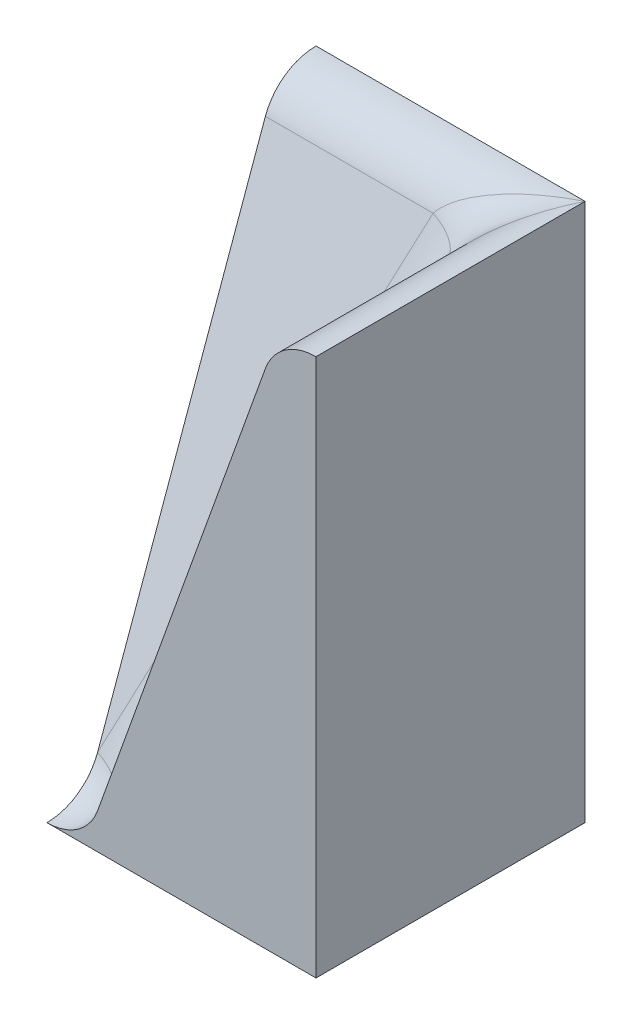
ISO-10303-21;
HEADER;
FILE_DESCRIPTION(('STEP AP214'),'2;1');
FILE_NAME('part.step','',(''),(''),'','','');
FILE_SCHEMA(('AUTOMOTIVE_DESIGN { 1 0 10303 214 1 1 1 1 }'));
ENDSEC;
DATA;
#1=APPLICATION_CONTEXT('core data for automotive mechanical design processes');
#2=APPLICATION_PROTOCOL_DEFINITION('international standard','automotive_design',2000,#1);
#3=PRODUCT_CONTEXT('',#1,'mechanical');
#4=PRODUCT('Part','Part','',(#3));
#5=PRODUCT_RELATED_PRODUCT_CATEGORY('part','',(#4));
#6=PRODUCT_DEFINITION_FORMATION('','',#4);
#7=PRODUCT_DEFINITION_CONTEXT('part definition',#1,'design');
#8=PRODUCT_DEFINITION('design','',#6,#7);
#9=PRODUCT_DEFINITION_SHAPE('','',#8);
#10=(LENGTH_UNIT() NAMED_UNIT(*) SI_UNIT(.MILLI.,.METRE.));
#11=(NAMED_UNIT(*) PLANE_ANGLE_UNIT() SI_UNIT($,.RADIAN.));
#12=(NAMED_UNIT(*) SI_UNIT($,.STERADIAN.) SOLID_ANGLE_UNIT());
#13=UNCERTAINTY_MEASURE_WITH_UNIT(LENGTH_MEASURE(1.E-05),#10,'distance_accuracy_value','');
#14=(GEOMETRIC_REPRESENTATION_CONTEXT(3) GLOBAL_UNCERTAINTY_ASSIGNED_CONTEXT((#13)) GLOBAL_UNIT_ASSIGNED_CONTEXT((#10,
#11,#12)) REPRESENTATION_CONTEXT('',''));
#15=CARTESIAN_POINT('',(0.,0.,0.));
#16=DIRECTION('',(0.,0.,1.));
#17=DIRECTION('',(1.,0.,0.));
#18=AXIS2_PLACEMENT_3D('',#15,#16,#17);
#19=CARTESIAN_POINT('',(188.21652956931,132.364669019181,-1000.));
#20=DIRECTION('',(-0.941082647846552,0.338176654904095,0.));
#21=DIRECTION('',(-0.338176654904095,-0.941082647846552,0.));
#22=AXIS2_PLACEMENT_3D('',#19,#20,#21);
#23=PLANE('',#22);
#24=DIRECTION('',(0.,0.,1.));
#25=VECTOR('',#24,1.);
#26=CARTESIAN_POINT('',(811.78347043069,1867.63533098082,-1000.));
#27=LINE('',#26,#25);
#28=CARTESIAN_POINT('',(811.78347043069,1867.63533098082,-623.56694086138));
#29=VERTEX_POINT('',#28);
#30=CARTESIAN_POINT('',(811.78347043069,1867.63533098082,0.));
#31=VERTEX_POINT('',#30);
#32=EDGE_CURVE('E146',#29,#31,#27,.T.);
#33=ORIENTED_EDGE('',*,*,#32,.F.);
#34=DIRECTION('',(-0.320354031960646,-0.891485607518773,0.320354031960646));
#35=VECTOR('',#34,1.);
#36=CARTESIAN_POINT('',(290.843235362753,417.955677822706,-102.626705793443));
#37=LINE('',#36,#35);
#38=CARTESIAN_POINT('',(188.21652956931,132.364669019181,0.));
#39=VERTEX_POINT('',#38);
#40=EDGE_CURVE('E42',#29,#39,#37,.T.);
#41=ORIENTED_EDGE('',*,*,#40,.T.);
#42=DIRECTION('',(-0.338176654904095,-0.941082647846552,0.));
#43=VECTOR('',#42,1.);
#44=CARTESIAN_POINT('',(188.21652956931,132.364669019181,0.));
#45=LINE('',#44,#43);
#46=EDGE_CURVE('E99',#31,#39,#45,.T.);
#47=ORIENTED_EDGE('',*,*,#46,.F.);
#48=EDGE_LOOP('',(#33,#41,#47));
#49=FACE_BOUND('',#48,.T.);
#50=ADVANCED_FACE('F33',(#49),#23,.T.);
#51=CARTESIAN_POINT('',(1000.,1800.,-1000.));
#52=DIRECTION('',(0.,0.,1.));
#53=DIRECTION('',(1.,0.,0.));
#54=AXIS2_PLACEMENT_3D('',#51,#52,#53);
#55=CYLINDRICAL_SURFACE('',#54,200.);
#56=DIRECTION('',(0.,0.,1.));
#57=VECTOR('',#56,1.);
#58=CARTESIAN_POINT('',(1000.,2000.,-1000.));
#59=LINE('',#58,#57);
#60=CARTESIAN_POINT('',(1000.,2000.,-1000.));
#61=VERTEX_POINT('',#60);
#62=CARTESIAN_POINT('',(1000.,2000.,0.));
#63=VERTEX_POINT('',#62);
#64=EDGE_CURVE('E149',#61,#63,#59,.T.);
#65=ORIENTED_EDGE('',*,*,#64,.F.);
#66=CARTESIAN_POINT('',(1000.,1800.,-1000.));
#67=DIRECTION('',(-0.894427190999916,0.,-0.447213595499958));
#68=DIRECTION('',(-0.447213595499958,0.,0.894427190999916));
#69=AXIS2_PLACEMENT_3D('',#66,#67,#68);
#70=ELLIPSE('',#69,447.213595499958,200.);
#71=EDGE_CURVE('E148',#61,#29,#70,.F.);
#72=ORIENTED_EDGE('',*,*,#71,.T.);
#73=ORIENTED_EDGE('',*,*,#32,.T.);
#74=CARTESIAN_POINT('',(1000.,1800.,0.));
#75=DIRECTION('',(0.,0.,1.));
#76=DIRECTION('',(1.,0.,0.));
#77=AXIS2_PLACEMENT_3D('',#74,#75,#76);
#78=CIRCLE('',#77,200.);
#79=EDGE_CURVE('E143',#63,#31,#78,.T.);
#80=ORIENTED_EDGE('',*,*,#79,.F.);
#81=EDGE_LOOP('',(#65,#72,#73,#80));
#82=FACE_BOUND('',#81,.T.);
#83=ADVANCED_FACE('F168',(#82),#55,.T.);
#84=CARTESIAN_POINT('',(1000.,0.,-1000.));
#85=DIRECTION('',(1.,0.,0.));
#86=DIRECTION('',(0.,0.,-1.));
#87=AXIS2_PLACEMENT_3D('',#84,#85,#86);
#88=PLANE('',#87);
#89=DIRECTION('',(0.,1.,0.));
#90=VECTOR('',#89,1.);
#91=CARTESIAN_POINT('',(1000.,0.,-1000.));
#92=LINE('',#91,#90);
#93=CARTESIAN_POINT('',(1000.,0.,-1000.));
#94=VERTEX_POINT('',#93);
#95=EDGE_CURVE('E124',#94,#61,#92,.T.);
#96=ORIENTED_EDGE('',*,*,#95,.T.);
#97=ORIENTED_EDGE('',*,*,#64,.T.);
#98=DIRECTION('',(0.,1.,0.));
#99=VECTOR('',#98,1.);
#100=CARTESIAN_POINT('',(1000.,0.,0.));
#101=LINE('',#100,#99);
#102=CARTESIAN_POINT('',(1000.,0.,0.));
#103=VERTEX_POINT('',#102);
#104=EDGE_CURVE('E114',#103,#63,#101,.T.);
#105=ORIENTED_EDGE('',*,*,#104,.F.);
#106=DIRECTION('',(0.,0.,1.));
#107=VECTOR('',#106,1.);
#108=CARTESIAN_POINT('',(1000.,0.,-1000.));
#109=LINE('',#108,#107);
#110=EDGE_CURVE('E112',#94,#103,#109,.T.);
#111=ORIENTED_EDGE('',*,*,#110,.F.);
#112=EDGE_LOOP('',(#96,#97,#105,#111));
#113=FACE_BOUND('',#112,.T.);
#114=ADVANCED_FACE('F189',(#113),#88,.T.);
#115=CARTESIAN_POINT('',(0.,0.,-1000.));
#116=DIRECTION('',(0.,-1.,0.));
#117=DIRECTION('',(0.,0.,-1.));
#118=AXIS2_PLACEMENT_3D('',#115,#116,#117);
#119=PLANE('',#118);
#120=DIRECTION('',(1.,0.,0.));
#121=VECTOR('',#120,1.);
#122=CARTESIAN_POINT('',(0.,0.,0.));
#123=LINE('',#122,#121);
#124=CARTESIAN_POINT('',(0.,0.,0.));
#125=VERTEX_POINT('',#124);
#126=EDGE_CURVE('E96',#125,#103,#123,.T.);
#127=ORIENTED_EDGE('',*,*,#126,.F.);
#128=DIRECTION('',(0.,0.,1.));
#129=VECTOR('',#128,1.);
#130=CARTESIAN_POINT('',(0.,0.,-1000.));
#131=LINE('',#130,#129);
#132=CARTESIAN_POINT('',(0.,0.,-1000.));
#133=VERTEX_POINT('',#132);
#134=EDGE_CURVE('E110',#133,#125,#131,.T.);
#135=ORIENTED_EDGE('',*,*,#134,.F.);
#136=DIRECTION('',(1.,0.,0.));
#137=VECTOR('',#136,1.);
#138=CARTESIAN_POINT('',(0.,0.,-1000.));
#139=LINE('',#138,#137);
#140=EDGE_CURVE('E138',#133,#94,#139,.T.);
#141=ORIENTED_EDGE('',*,*,#140,.T.);
#142=ORIENTED_EDGE('',*,*,#110,.T.);
#143=EDGE_LOOP('',(#127,#135,#141,#142));
#144=FACE_BOUND('',#143,.T.);
#145=ADVANCED_FACE('F108',(#144),#119,.T.);
#146=CARTESIAN_POINT('',(0.,200.,-1000.));
#147=DIRECTION('',(0.,0.,1.));
#148=DIRECTION('',(1.,0.,0.));
#149=AXIS2_PLACEMENT_3D('',#146,#147,#148);
#150=PLANE('',#149);
#151=ORIENTED_EDGE('',*,*,#140,.F.);
#152=DIRECTION('',(0.,1.,0.));
#153=VECTOR('',#152,1.);
#154=CARTESIAN_POINT('',(0.,0.,-1000.));
#155=LINE('',#154,#153);
#156=CARTESIAN_POINT('',(0.,2000.,-1000.));
#157=VERTEX_POINT('',#156);
#158=EDGE_CURVE('E123',#133,#157,#155,.T.);
#159=ORIENTED_EDGE('',*,*,#158,.T.);
#160=DIRECTION('',(-1.,0.,0.));
#161=VECTOR('',#160,1.);
#162=CARTESIAN_POINT('',(1000.,2000.,-1000.));
#163=LINE('',#162,#161);
#164=EDGE_CURVE('E104',#61,#157,#163,.T.);
#165=ORIENTED_EDGE('',*,*,#164,.F.);
#166=ORIENTED_EDGE('',*,*,#95,.F.);
#167=EDGE_LOOP('',(#151,#159,#165,#166));
#168=FACE_BOUND('',#167,.T.);
#169=ADVANCED_FACE('F179',(#168),#150,.F.);
#170=CARTESIAN_POINT('',(0.,200.,0.));
#171=DIRECTION('',(0.,0.,1.));
#172=DIRECTION('',(1.,0.,0.));
#173=AXIS2_PLACEMENT_3D('',#170,#171,#172);
#174=PLANE('',#173);
#175=CARTESIAN_POINT('',(0.,200.,0.));
#176=DIRECTION('',(0.,0.,-1.));
#177=DIRECTION('',(1.,0.,0.));
#178=AXIS2_PLACEMENT_3D('',#175,#176,#177);
#179=CIRCLE('',#178,200.);
#180=EDGE_CURVE('E92',#39,#125,#179,.T.);
#181=ORIENTED_EDGE('',*,*,#180,.T.);
#182=ORIENTED_EDGE('',*,*,#126,.T.);
#183=ORIENTED_EDGE('',*,*,#104,.T.);
#184=ORIENTED_EDGE('',*,*,#79,.T.);
#185=ORIENTED_EDGE('',*,*,#46,.T.);
#186=EDGE_LOOP('',(#181,#182,#183,#184,#185));
#187=FACE_BOUND('',#186,.T.);
#188=ADVANCED_FACE('F94',(#187),#174,.T.);
#189=CARTESIAN_POINT('',(1000.,1800.,-1000.));
#190=DIRECTION('',(-1.,0.,0.));
#191=DIRECTION('',(0.,0.,1.));
#192=AXIS2_PLACEMENT_3D('',#189,#190,#191);
#193=CYLINDRICAL_SURFACE('',#192,200.);
#194=DIRECTION('',(-1.,0.,0.));
#195=VECTOR('',#194,1.);
#196=CARTESIAN_POINT('',(1000.,1867.63533098082,-811.78347043069));
#197=LINE('',#196,#195);
#198=CARTESIAN_POINT('',(623.566940861379,1867.63533098082,-811.78347043069));
#199=VERTEX_POINT('',#198);
#200=CARTESIAN_POINT('',(0.,1867.63533098082,-811.78347043069));
#201=VERTEX_POINT('',#200);
#202=EDGE_CURVE('E134',#199,#201,#197,.T.);
#203=ORIENTED_EDGE('',*,*,#202,.F.);
#204=CARTESIAN_POINT('',(1000.,1800.,-1000.));
#205=DIRECTION('',(-0.447213595499958,0.,-0.894427190999916));
#206=DIRECTION('',(-0.894427190999916,0.,0.447213595499958));
#207=AXIS2_PLACEMENT_3D('',#204,#205,#206);
#208=ELLIPSE('',#207,447.213595499958,200.);
#209=EDGE_CURVE('E154',#199,#61,#208,.T.);
#210=ORIENTED_EDGE('',*,*,#209,.T.);
#211=ORIENTED_EDGE('',*,*,#164,.T.);
#212=CARTESIAN_POINT('',(0.,1800.,-1000.));
#213=DIRECTION('',(1.,0.,0.));
#214=DIRECTION('',(0.,0.,-1.));
#215=AXIS2_PLACEMENT_3D('',#212,#213,#214);
#216=CIRCLE('',#215,200.);
#217=EDGE_CURVE('E127',#157,#201,#216,.T.);
#218=ORIENTED_EDGE('',*,*,#217,.T.);
#219=EDGE_LOOP('',(#203,#210,#211,#218));
#220=FACE_BOUND('',#219,.T.);
#221=ADVANCED_FACE('F171',(#220),#193,.T.);
#222=CARTESIAN_POINT('',(1000.,132.364669019181,-188.21652956931));
#223=DIRECTION('',(0.,-0.338176654904095,-0.941082647846552));
#224=DIRECTION('',(0.,0.941082647846552,-0.338176654904095));
#225=AXIS2_PLACEMENT_3D('',#222,#223,#224);
#226=PLANE('',#225);
#227=DIRECTION('',(0.,-0.941082647846552,0.338176654904095));
#228=VECTOR('',#227,1.);
#229=CARTESIAN_POINT('',(0.,132.364669019181,-188.21652956931));
#230=LINE('',#229,#228);
#231=CARTESIAN_POINT('',(0.,132.364669019181,-188.21652956931));
#232=VERTEX_POINT('',#231);
#233=EDGE_CURVE('E132',#201,#232,#230,.T.);
#234=ORIENTED_EDGE('',*,*,#233,.T.);
#235=DIRECTION('',(-0.320354031960646,-0.891485607518773,0.320354031960646));
#236=VECTOR('',#235,1.);
#237=CARTESIAN_POINT('',(102.626705793442,417.955677822705,-290.843235362753));
#238=LINE('',#237,#236);
#239=EDGE_CURVE('E11',#232,#199,#238,.F.);
#240=ORIENTED_EDGE('',*,*,#239,.T.);
#241=ORIENTED_EDGE('',*,*,#202,.T.);
#242=EDGE_LOOP('',(#234,#240,#241));
#243=FACE_BOUND('',#242,.T.);
#244=ADVANCED_FACE('F176',(#243),#226,.F.);
#245=CARTESIAN_POINT('',(0.,200.,0.));
#246=DIRECTION('',(1.,0.,0.));
#247=DIRECTION('',(0.,0.,-1.));
#248=AXIS2_PLACEMENT_3D('',#245,#246,#247);
#249=PLANE('',#248);
#250=CARTESIAN_POINT('',(0.,200.,0.));
#251=DIRECTION('',(-1.,0.,0.));
#252=DIRECTION('',(0.,0.,-1.));
#253=AXIS2_PLACEMENT_3D('',#250,#251,#252);
#254=CIRCLE('',#253,200.);
#255=EDGE_CURVE('E121',#232,#125,#254,.T.);
#256=ORIENTED_EDGE('',*,*,#255,.F.);
#257=ORIENTED_EDGE('',*,*,#233,.F.);
#258=ORIENTED_EDGE('',*,*,#217,.F.);
#259=ORIENTED_EDGE('',*,*,#158,.F.);
#260=ORIENTED_EDGE('',*,*,#134,.T.);
#261=EDGE_LOOP('',(#256,#257,#258,#259,#260));
#262=FACE_BOUND('',#261,.T.);
#263=ADVANCED_FACE('F119',(#262),#249,.F.);
#264=CARTESIAN_POINT('',(0.,200.,0.));
#265=DIRECTION('',(0.,0.,1.));
#266=DIRECTION('',(1.,0.,0.));
#267=AXIS2_PLACEMENT_3D('',#264,#265,#266);
#268=SPHERICAL_SURFACE('',#267,200.);
#269=ORIENTED_EDGE('',*,*,#255,.T.);
#270=ORIENTED_EDGE('',*,*,#180,.F.);
#271=CARTESIAN_POINT('',(0.,200.,0.));
#272=DIRECTION('',(-0.320354031960646,-0.891485607518773,0.320354031960646));
#273=DIRECTION('',(0.,-0.338176654904095,-0.941082647846551));
#274=AXIS2_PLACEMENT_3D('',#271,#272,#273);
#275=CIRCLE('',#274,200.);
#276=EDGE_CURVE('E37',#232,#39,#275,.T.);
#277=ORIENTED_EDGE('',*,*,#276,.F.);
#278=EDGE_LOOP('',(#269,#270,#277));
#279=FACE_BOUND('',#278,.T.);
#280=ADVANCED_FACE('F35',(#279),#268,.F.);
#281=CARTESIAN_POINT('',(102.626705793442,485.591008803525,-102.626705793442));
#282=DIRECTION('',(-0.320354031960646,-0.891485607518773,0.320354031960646));
#283=DIRECTION('',(0.,-0.338176654904095,-0.941082647846552));
#284=AXIS2_PLACEMENT_3D('',#281,#282,#283);
#285=CYLINDRICAL_SURFACE('',#284,200.);
#286=ORIENTED_EDGE('',*,*,#276,.T.);
#287=ORIENTED_EDGE('',*,*,#40,.F.);
#288=CARTESIAN_POINT('',(623.566940861379,1935.27066196164,-623.56694086138));
#289=DIRECTION('',(-0.320354031960645,-0.891485607518773,0.320354031960646));
#290=DIRECTION('',(0.,-0.338176654904095,-0.941082647846551));
#291=AXIS2_PLACEMENT_3D('',#288,#289,#290);
#292=CIRCLE('',#291,200.);
#293=EDGE_CURVE('E56',#199,#29,#292,.T.);
#294=ORIENTED_EDGE('',*,*,#293,.F.);
#295=ORIENTED_EDGE('',*,*,#239,.F.);
#296=EDGE_LOOP('',(#286,#287,#294,#295));
#297=FACE_BOUND('',#296,.T.);
#298=ADVANCED_FACE('F166',(#297),#285,.F.);
#299=CARTESIAN_POINT('',(1000.,2000.,-1000.));
#300=CARTESIAN_POINT('',(1000.,2000.,-1000.));
#301=CARTESIAN_POINT('',(1000.,2000.,-1000.));
#302=CARTESIAN_POINT('',(997.821543042189,1999.99998598145,-995.643086084386));
#303=CARTESIAN_POINT('',(996.732312609734,2000.00009257002,-996.73231260974));
#304=CARTESIAN_POINT('',(995.643086084377,1999.99998598145,-997.821543042193));
#305=CARTESIAN_POINT('',(995.643089758799,1999.96440685523,-991.286179517609));
#306=CARTESIAN_POINT('',(993.464052759437,1999.92881060137,-993.464052759444));
#307=CARTESIAN_POINT('',(991.286179517599,1999.96440685523,-995.643089758804));
#308=CARTESIAN_POINT('',(991.287334725908,1999.82201887214,-982.574669451824));
#309=CARTESIAN_POINT('',(986.933911702079,1999.64404721373,-986.933911702085));
#310=CARTESIAN_POINT('',(982.574669451816,1999.82201887214,-991.287334725912));
#311=CARTESIAN_POINT('',(989.110032983394,1999.71520958786,-978.220065966792));
#312=CARTESIAN_POINT('',(983.670870222132,1999.43046359838,-983.670870222135));
#313=CARTESIAN_POINT('',(978.220065966788,1999.71520958786,-989.110032983397));
#314=CARTESIAN_POINT('',(984.757572444315,1999.43025005547,-969.515144888631));
#315=CARTESIAN_POINT('',(977.156161204686,1998.86116765898,-977.156161204687));
#316=CARTESIAN_POINT('',(969.515144888629,1999.43025005547,-984.757572444316));
#317=CARTESIAN_POINT('',(982.582413838686,1999.25209394171,-965.164827677375));
#318=CARTESIAN_POINT('',(973.903342500863,1998.50524091031,-973.903342500866));
#319=CARTESIAN_POINT('',(965.164827677372,1999.25209394171,-982.582413838688));
#320=CARTESIAN_POINT('',(978.235665707899,1998.82425188856,-956.4713314158));
#321=CARTESIAN_POINT('',(967.414748888115,1997.65164210636,-967.414748888117));
#322=CARTESIAN_POINT('',(956.471331415798,1998.82425188856,-978.2356657079));
#323=CARTESIAN_POINT('',(976.064076176094,1998.57456608253,-952.128152352188));
#324=CARTESIAN_POINT('',(964.177836107292,1997.15366644307,-964.177836107292));
#325=CARTESIAN_POINT('',(952.128152352188,1998.57456608253,-976.064076176094));
#326=CARTESIAN_POINT('',(969.593388795519,1997.72268953554,-939.186777591037));
#327=CARTESIAN_POINT('',(954.5489193499,1995.45600402381,-954.548919349898));
#328=CARTESIAN_POINT('',(939.186777591038,1997.72268953554,-969.593388795518));
#329=CARTESIAN_POINT('',(965.300960072709,1997.01523097853,-930.601920145415));
#330=CARTESIAN_POINT('',(948.189529441129,1994.04758384981,-948.18952944113));
#331=CARTESIAN_POINT('',(930.601920145415,1997.01523097853,-965.300960072709));
#332=CARTESIAN_POINT('',(956.744640928155,1995.31512940242,-913.489281856307));
#333=CARTESIAN_POINT('',(935.606653135611,1990.68093629114,-935.606653135612));
#334=CARTESIAN_POINT('',(913.489281856306,1995.31512940242,-956.744640928156));
#335=CARTESIAN_POINT('',(952.480749871334,1994.3224927514,-904.961499742667));
#336=CARTESIAN_POINT('',(929.374903381872,1988.71800877709,-929.374903381872));
#337=CARTESIAN_POINT('',(904.961499742667,1994.3224927514,-952.480749871334));
#338=CARTESIAN_POINT('',(944.062689022877,1992.06687743551,-888.125378045754));
#339=CARTESIAN_POINT('',(917.195997314522,1984.2878218244,-917.195997314521));
#340=CARTESIAN_POINT('',(888.125378045754,1992.06687743551,-944.062689022876));
#341=CARTESIAN_POINT('',(939.907877380719,1990.8087026761,-879.815754761438));
#342=CARTESIAN_POINT('',(911.23798283431,1981.82337513585,-911.23798283431));
#343=CARTESIAN_POINT('',(879.815754761438,1990.8087026761,-939.907877380719));
#344=CARTESIAN_POINT('',(931.646451744684,1988.00749237577,-863.292903489369));
#345=CARTESIAN_POINT('',(899.543763921972,1976.38142270471,-899.543763921972));
#346=CARTESIAN_POINT('',(863.292903489369,1988.00749237577,-931.646451744684));
#347=CARTESIAN_POINT('',(927.539837542643,1986.46445806564,-855.079675085288));
#348=CARTESIAN_POINT('',(893.80121785618,1973.39662729483,-893.80121785618));
#349=CARTESIAN_POINT('',(855.079675085288,1986.46445806564,-927.539837542643));
#350=CARTESIAN_POINT('',(919.487054873633,1983.12888621249,-838.974109747265));
#351=CARTESIAN_POINT('',(882.727635063959,1967.01039933759,-882.727635063959));
#352=CARTESIAN_POINT('',(838.974109747264,1983.12888621249,-919.487054873633));
#353=CARTESIAN_POINT('',(915.539424425514,1981.34341886433,-831.078848851021));
#354=CARTESIAN_POINT('',(877.383950313126,1963.61234783072,-877.383950313127));
#355=CARTESIAN_POINT('',(831.078848851021,1981.34341886433,-915.539424425514));
#356=CARTESIAN_POINT('',(907.713875274253,1977.488859412,-815.427750548502));
#357=CARTESIAN_POINT('',(867.006912782094,1956.36515793028,-867.006912782094));
#358=CARTESIAN_POINT('',(815.427750548501,1977.488859412,-907.713875274253));
#359=CARTESIAN_POINT('',(903.835955708618,1975.41977081966,-807.671911417236));
#360=CARTESIAN_POINT('',(861.97005660579,1952.50711971716,-861.97005660579));
#361=CARTESIAN_POINT('',(807.671911417236,1975.41977081966,-903.835955708618));
#362=CARTESIAN_POINT('',(896.285919888373,1971.0607556029,-792.571839776744));
#363=CARTESIAN_POINT('',(852.418347200414,1944.50193880563,-852.418347200413));
#364=CARTESIAN_POINT('',(792.571839776744,1971.0607556029,-896.285919888373));
#365=CARTESIAN_POINT('',(892.611179451483,1968.77993407095,-785.222358902956));
#366=CARTESIAN_POINT('',(847.888677273831,1940.35767559629,-847.888677273831));
#367=CARTESIAN_POINT('',(785.222358902956,1968.77993407095,-892.611179451483));
#368=CARTESIAN_POINT('',(885.355114667715,1963.93771417279,-770.710229335422));
#369=CARTESIAN_POINT('',(839.227149965009,1931.71535809323,-839.227149965009));
#370=CARTESIAN_POINT('',(770.710229335422,1963.93771417279,-885.355114667715));
#371=CARTESIAN_POINT('',(881.773788738447,1961.37632056314,-763.547577476896));
#372=CARTESIAN_POINT('',(835.09536540267,1927.20834343302,-835.09536540267));
#373=CARTESIAN_POINT('',(763.547577476896,1961.37632056314,-881.773788738447));
#374=CARTESIAN_POINT('',(874.855326270105,1956.06759691192,-749.710652540208));
#375=CARTESIAN_POINT('',(827.437444239726,1918.07484094446,-827.437444239726));
#376=CARTESIAN_POINT('',(749.710652540208,1956.06759691192,-874.855326270105));
#377=CARTESIAN_POINT('',(871.51407958048,1953.33099828883,-743.028159160946));
#378=CARTESIAN_POINT('',(823.894393978917,1913.44929725811,-823.894393978917));
#379=CARTESIAN_POINT('',(743.028159160945,1953.33099828883,-871.51407958048));
#380=CARTESIAN_POINT('',(864.951402576022,1947.58353759311,-729.90280515203));
#381=CARTESIAN_POINT('',(817.283079845907,1903.98870072749,-817.283079845907));
#382=CARTESIAN_POINT('',(729.902805152029,1947.58353759311,-864.951402576022));
#383=CARTESIAN_POINT('',(861.729969439306,1944.57268198562,-723.459938878611));
#384=CARTESIAN_POINT('',(814.218714814164,1899.14680212536,-814.218714814164));
#385=CARTESIAN_POINT('',(723.459938878611,1944.57268198562,-861.729969439306));
#386=CARTESIAN_POINT('',(855.561236825335,1938.40394923131,-711.12247365067));
#387=CARTESIAN_POINT('',(808.736842071907,1889.5535593505,-808.736842071907));
#388=CARTESIAN_POINT('',(711.12247365067,1938.40394923131,-855.561236825335));
#389=CARTESIAN_POINT('',(852.608105382456,1935.25775724655,-705.2162107649));
#390=CARTESIAN_POINT('',(806.301136029742,1884.79960639833,-806.301136029742));
#391=CARTESIAN_POINT('',(705.2162107649,1935.25775724655,-852.608105382456));
#392=CARTESIAN_POINT('',(846.850951612381,1928.70273520971,-693.701903224748));
#393=CARTESIAN_POINT('',(801.951889746768,1875.28084053063,-801.951889746768));
#394=CARTESIAN_POINT('',(693.701903224748,1928.70273520971,-846.850951612381));
#395=CARTESIAN_POINT('',(844.046924528382,1925.29391354468,-688.09384905676));
#396=CARTESIAN_POINT('',(800.045370104668,1870.51378050016,-800.045370104668));
#397=CARTESIAN_POINT('',(688.09384905676,1925.29391354468,-844.046924528382));
#398=CARTESIAN_POINT('',(838.733521863404,1918.36936776094,-677.46704372681));
#399=CARTESIAN_POINT('',(796.856754320209,1861.30763926878,-796.856754320209));
#400=CARTESIAN_POINT('',(677.46704372681,1918.36936776094,-838.733521863404));
#401=CARTESIAN_POINT('',(836.216573141186,1914.86527972753,-672.43314628237));
#402=CARTESIAN_POINT('',(795.556998342448,1856.861174928,-795.556998342448));
#403=CARTESIAN_POINT('',(672.43314628237,1914.86527972753,-836.216573141186));
#404=CARTESIAN_POINT('',(831.363406308753,1907.61377532758,-662.726812617503));
#405=CARTESIAN_POINT('',(793.467455019395,1848.20045050985,-793.467455019395));
#406=CARTESIAN_POINT('',(662.726812617503,1907.61377532758,-831.363406308753));
#407=CARTESIAN_POINT('',(829.027180678752,1903.8663690973,-658.054361357503));
#408=CARTESIAN_POINT('',(792.685740246229,1843.99029937015,-792.685740246229));
#409=CARTESIAN_POINT('',(658.054361357503,1903.8663690973,-829.027180678752));
#410=CARTESIAN_POINT('',(825.727664492867,1898.15147064792,-651.455328985735));
#411=CARTESIAN_POINT('',(791.896712195577,1838.07033287864,-791.896712195577));
#412=CARTESIAN_POINT('',(651.455328985735,1898.15147064792,-825.727664492867));
#413=CARTESIAN_POINT('',(824.684174307805,1896.27574827208,-649.368348615612));
#414=CARTESIAN_POINT('',(791.69798199305,1836.19224696985,-791.69798199305));
#415=CARTESIAN_POINT('',(649.368348615612,1896.27574827208,-824.684174307805));
#416=CARTESIAN_POINT('',(822.647599135652,1892.47043573619,-645.295198271302));
#417=CARTESIAN_POINT('',(791.408622967789,1832.53914968761,-791.408622967789));
#418=CARTESIAN_POINT('',(645.295198271302,1892.47043573619,-822.647599135652));
#419=CARTESIAN_POINT('',(821.654509568578,1890.54085049552,-643.30901913715));
#420=CARTESIAN_POINT('',(791.318806131024,1830.76517327699,-791.318806131024));
#421=CARTESIAN_POINT('',(643.30901913715,1890.54085049552,-821.654509568578));
#422=CARTESIAN_POINT('',(819.721781524135,1886.62865988829,-639.443563048264));
#423=CARTESIAN_POINT('',(791.240601964452,1827.33629224428,-791.240601964452));
#424=CARTESIAN_POINT('',(639.443563048264,1886.62865988829,-819.721781524135));
#425=CARTESIAN_POINT('',(818.782146700051,1884.64605091148,-637.5642934001));
#426=CARTESIAN_POINT('',(791.252969758162,1825.68262047924,-791.252969758162));
#427=CARTESIAN_POINT('',(637.564293400099,1884.64605091148,-818.782146700051));
#428=CARTESIAN_POINT('',(816.959703942842,1880.6294785145,-633.919407885684));
#429=CARTESIAN_POINT('',(791.370097390906,1822.50988154364,-791.370097390906));
#430=CARTESIAN_POINT('',(633.919407885684,1880.6294785145,-816.959703942842));
#431=CARTESIAN_POINT('',(816.076890423089,1878.59552017042,-632.153780846175));
#432=CARTESIAN_POINT('',(791.475492288582,1820.99217384578,-791.475492288582));
#433=CARTESIAN_POINT('',(632.153780846175,1878.59552017042,-816.076890423089));
#434=CARTESIAN_POINT('',(814.404633200779,1874.55833450794,-628.809266401561));
#435=CARTESIAN_POINT('',(791.761561563591,1818.16177556907,-791.761561563591));
#436=CARTESIAN_POINT('',(628.809266401561,1874.55833450794,-814.404633200779));
#437=CARTESIAN_POINT('',(813.612888613188,1872.55701397908,-627.225777226387));
#438=CARTESIAN_POINT('',(791.939634460055,1816.84437091328,-791.939634460055));
#439=CARTESIAN_POINT('',(627.225777226387,1872.55701397908,-813.612888613188));
#440=CARTESIAN_POINT('',(812.087841281517,1868.51054571743,-624.17568256302));
#441=CARTESIAN_POINT('',(792.358454091455,1814.35675770487,-792.358454091456));
#442=CARTESIAN_POINT('',(624.17568256302,1868.51054571743,-812.087841281517));
#443=CARTESIAN_POINT('',(811.354532417229,1866.46540260289,-622.709064834409));
#444=CARTESIAN_POINT('',(792.599521445729,1813.18790685861,-792.59952144573));
#445=CARTESIAN_POINT('',(622.709064834409,1866.46540260289,-811.354532417229));
#446=CARTESIAN_POINT('',(809.949174597373,1862.33334614537,-619.898349194697));
#447=CARTESIAN_POINT('',(793.130335092017,1811.00471243973,-793.130335092017));
#448=CARTESIAN_POINT('',(619.898349194697,1862.33334614537,-809.949174597373));
#449=CARTESIAN_POINT('',(809.277127150348,1860.24643177532,-618.554254300683));
#450=CARTESIAN_POINT('',(793.420269822428,1809.99175352607,-793.420269822428));
#451=CARTESIAN_POINT('',(618.554254300683,1860.24643177532,-809.277127150348));
#452=CARTESIAN_POINT('',(807.997180193307,1856.03359308159,-615.994360386626));
#453=CARTESIAN_POINT('',(794.033154462321,1808.12443509919,-794.033154462321));
#454=CARTESIAN_POINT('',(615.994360386626,1856.03359308159,-807.997180193307));
#455=CARTESIAN_POINT('',(807.389280308593,1853.90766898587,-614.778560617184));
#456=CARTESIAN_POINT('',(794.356149455917,1807.27140826923,-794.356149455917));
#457=CARTESIAN_POINT('',(614.778560617184,1853.90766898587,-807.389280308593));
#458=CARTESIAN_POINT('',(806.257539356103,1849.68395439724,-612.515078712207));
#459=CARTESIAN_POINT('',(795.008313290213,1805.74707166212,-795.008313290213));
#460=CARTESIAN_POINT('',(612.515078712207,1849.68395439724,-806.257539356103));
#461=CARTESIAN_POINT('',(805.731730537322,1847.58721887503,-611.46346107466));
#462=CARTESIAN_POINT('',(795.336977119013,1805.07212476592,-795.336977119013));
#463=CARTESIAN_POINT('',(611.46346107466,1847.58721887503,-805.731730537322));
#464=CARTESIAN_POINT('',(804.745459123923,1843.36320842358,-609.490918247829));
#465=CARTESIAN_POINT('',(795.993395580669,1803.86707783646,-795.993395580669));
#466=CARTESIAN_POINT('',(609.490918247829,1843.36320842358,-804.745459123923));
#467=CARTESIAN_POINT('',(804.284996193401,1841.23593365138,-608.569992386733));
#468=CARTESIAN_POINT('',(796.320968312562,1803.33796766918,-796.320968312562));
#469=CARTESIAN_POINT('',(608.569992386733,1841.23593365138,-804.284996193401));
#470=CARTESIAN_POINT('',(803.431613518117,1836.95448586265,-606.863227036166));
#471=CARTESIAN_POINT('',(796.959113342349,1802.4157002832,-796.959113342349));
#472=CARTESIAN_POINT('',(606.863227036165,1836.95448586265,-803.431613518117));
#473=CARTESIAN_POINT('',(803.038692222842,1834.80031346481,-606.077384445666));
#474=CARTESIAN_POINT('',(797.269429152224,1802.02336186169,-797.269429152224));
#475=CARTESIAN_POINT('',(606.077384445666,1834.80031346481,-803.038692222842));
#476=CARTESIAN_POINT('',(802.322331712118,1830.46896392002,-604.644663424254));
#477=CARTESIAN_POINT('',(797.857661106272,1801.36101038263,-797.857661106272));
#478=CARTESIAN_POINT('',(604.644663424254,1830.46896392002,-802.322331712118));
#479=CARTESIAN_POINT('',(801.998892305812,1828.29178683628,-603.997784611628));
#480=CARTESIAN_POINT('',(798.135279128516,1801.09162923248,-798.135279128516));
#481=CARTESIAN_POINT('',(603.997784611628,1828.29178683628,-801.998892305812));
#482=CARTESIAN_POINT('',(801.427855697733,1823.95433352809,-602.855711395462));
#483=CARTESIAN_POINT('',(798.63998164395,1800.66054051724,-798.63998164395));
#484=CARTESIAN_POINT('',(602.855711395462,1823.95433352809,-801.427855697733));
#485=CARTESIAN_POINT('',(801.179108120889,1821.79436034152,-602.35821624178));
#486=CARTESIAN_POINT('',(798.867538134501,1800.4975611356,-798.867538134501));
#487=CARTESIAN_POINT('',(602.35821624178,1821.79436034152,-801.179108120889));
#488=CARTESIAN_POINT('',(800.751739494819,1817.46057463552,-601.503478989636));
#489=CARTESIAN_POINT('',(799.26652140357,1800.2510901987,-799.26652140357));
#490=CARTESIAN_POINT('',(601.503478989636,1817.46057463552,-800.751739494819));
#491=CARTESIAN_POINT('',(800.573118161656,1815.28676217217,-601.146236323297));
#492=CARTESIAN_POINT('',(799.437694426338,1800.1678497901,-799.437694426338));
#493=CARTESIAN_POINT('',(601.146236323297,1815.28676217217,-800.573118161656));
#494=CARTESIAN_POINT('',(800.286942504092,1810.9298132764,-600.57388500817));
#495=CARTESIAN_POINT('',(799.715319836448,1800.05634358954,-799.715319836448));
#496=CARTESIAN_POINT('',(600.57388500817,1810.9298132764,-800.286942504092));
#497=CARTESIAN_POINT('',(800.179387500228,1808.74667693334,-600.358775000452));
#498=CARTESIAN_POINT('',(799.821583381844,1800.02819461887,-799.821583381844));
#499=CARTESIAN_POINT('',(600.358775000452,1808.74667693334,-800.179387500228));
#500=CARTESIAN_POINT('',(800.035916209173,1804.37569373027,-600.07183241835));
#501=CARTESIAN_POINT('',(799.963974064214,1800.00001026964,-799.963974064214));
#502=CARTESIAN_POINT('',(600.07183241835,1804.37569373027,-800.035916209173));
#503=CARTESIAN_POINT('',(800.,1802.18784686514,-600.));
#504=CARTESIAN_POINT('',(800.,1800.00000513575,-800.));
#505=CARTESIAN_POINT('',(600.,1802.18784686514,-800.));
#506=CARTESIAN_POINT('',(800.,1797.81215313486,-600.));
#507=CARTESIAN_POINT('',(800.,1799.99999486425,-800.));
#508=CARTESIAN_POINT('',(600.,1797.81215313486,-800.));
#509=CARTESIAN_POINT('',(800.035916209173,1795.62430626973,-600.07183241835));
#510=CARTESIAN_POINT('',(799.963974064214,1799.99998973036,-799.963974064214));
#511=CARTESIAN_POINT('',(600.07183241835,1795.62430626973,-800.035916209173));
#512=CARTESIAN_POINT('',(800.179387500228,1791.25332306666,-600.358775000452));
#513=CARTESIAN_POINT('',(799.821583381844,1799.97180538113,-799.821583381844));
#514=CARTESIAN_POINT('',(600.358775000452,1791.25332306666,-800.179387500228));
#515=CARTESIAN_POINT('',(800.286942504092,1789.0701867236,-600.57388500817));
#516=CARTESIAN_POINT('',(799.715319836448,1799.94365641046,-799.715319836448));
#517=CARTESIAN_POINT('',(600.57388500817,1789.0701867236,-800.286942504092));
#518=CARTESIAN_POINT('',(800.573118161656,1784.71323782783,-601.146236323297));
#519=CARTESIAN_POINT('',(799.437694426338,1799.8321502099,-799.437694426338));
#520=CARTESIAN_POINT('',(601.146236323297,1784.71323782783,-800.573118161656));
#521=CARTESIAN_POINT('',(800.751739494819,1782.53942536448,-601.503478989636));
#522=CARTESIAN_POINT('',(799.26652140357,1799.7489098013,-799.26652140357));
#523=CARTESIAN_POINT('',(601.503478989636,1782.53942536448,-800.751739494819));
#524=CARTESIAN_POINT('',(801.179108120889,1778.20563965848,-602.35821624178));
#525=CARTESIAN_POINT('',(798.867538134501,1799.5024388644,-798.867538134501));
#526=CARTESIAN_POINT('',(602.35821624178,1778.20563965848,-801.179108120889));
#527=CARTESIAN_POINT('',(801.427855697733,1776.04566647191,-602.855711395462));
#528=CARTESIAN_POINT('',(798.63998164395,1799.33945948276,-798.63998164395));
#529=CARTESIAN_POINT('',(602.855711395462,1776.04566647191,-801.427855697733));
#530=CARTESIAN_POINT('',(801.998892305812,1771.70821316372,-603.997784611628));
#531=CARTESIAN_POINT('',(798.135279128516,1798.90837076752,-798.135279128516));
#532=CARTESIAN_POINT('',(603.997784611628,1771.70821316372,-801.998892305812));
#533=CARTESIAN_POINT('',(802.322331712118,1769.53103607998,-604.644663424254));
#534=CARTESIAN_POINT('',(797.857661106272,1798.63898961737,-797.857661106272));
#535=CARTESIAN_POINT('',(604.644663424254,1769.53103607998,-802.322331712118));
#536=CARTESIAN_POINT('',(803.038692222842,1765.19968653519,-606.077384445666));
#537=CARTESIAN_POINT('',(797.269429152224,1797.97663813831,-797.269429152224));
#538=CARTESIAN_POINT('',(606.077384445666,1765.19968653519,-803.038692222842));
#539=CARTESIAN_POINT('',(803.431613518117,1763.04551413735,-606.863227036165));
#540=CARTESIAN_POINT('',(796.959113342349,1797.5842997168,-796.959113342349));
#541=CARTESIAN_POINT('',(606.863227036165,1763.04551413735,-803.431613518117));
#542=CARTESIAN_POINT('',(804.284996193401,1758.76406634862,-608.569992386733));
#543=CARTESIAN_POINT('',(796.320968312562,1796.66203233082,-796.320968312562));
#544=CARTESIAN_POINT('',(608.569992386733,1758.76406634862,-804.284996193401));
#545=CARTESIAN_POINT('',(804.745459123923,1756.63679157642,-609.490918247829));
#546=CARTESIAN_POINT('',(795.993395580669,1796.13292216354,-795.993395580669));
#547=CARTESIAN_POINT('',(609.490918247829,1756.63679157642,-804.745459123923));
#548=CARTESIAN_POINT('',(805.731730537322,1752.41278112497,-611.46346107466));
#549=CARTESIAN_POINT('',(795.336977119014,1794.92787523409,-795.336977119013));
#550=CARTESIAN_POINT('',(611.46346107466,1752.41278112497,-805.731730537322));
#551=CARTESIAN_POINT('',(806.257539356103,1750.31604560276,-612.515078712207));
#552=CARTESIAN_POINT('',(795.008313290213,1794.25292833788,-795.008313290213));
#553=CARTESIAN_POINT('',(612.515078712207,1750.31604560276,-806.257539356103));
#554=CARTESIAN_POINT('',(807.389280308593,1746.09233101413,-614.778560617184));
#555=CARTESIAN_POINT('',(794.356149455917,1792.72859173077,-794.356149455917));
#556=CARTESIAN_POINT('',(614.778560617184,1746.09233101413,-807.389280308593));
#557=CARTESIAN_POINT('',(807.997180193307,1743.96640691841,-615.994360386626));
#558=CARTESIAN_POINT('',(794.033154462321,1791.87556490081,-794.033154462322));
#559=CARTESIAN_POINT('',(615.994360386626,1743.96640691841,-807.997180193307));
#560=CARTESIAN_POINT('',(809.277127150348,1739.75356822468,-618.554254300683));
#561=CARTESIAN_POINT('',(793.420269822428,1790.00824647393,-793.420269822428));
#562=CARTESIAN_POINT('',(618.554254300683,1739.75356822468,-809.277127150347));
#563=CARTESIAN_POINT('',(809.949174597373,1737.66665385463,-619.898349194697));
#564=CARTESIAN_POINT('',(793.130335092017,1788.99528756027,-793.130335092017));
#565=CARTESIAN_POINT('',(619.898349194697,1737.66665385463,-809.949174597372));
#566=CARTESIAN_POINT('',(811.354532417229,1733.53459739711,-622.709064834409));
#567=CARTESIAN_POINT('',(792.599521445729,1786.81209314139,-792.599521445729));
#568=CARTESIAN_POINT('',(622.709064834409,1733.53459739711,-811.354532417229));
#569=CARTESIAN_POINT('',(812.087841281517,1731.48945428257,-624.17568256302));
#570=CARTESIAN_POINT('',(792.358454091456,1785.64324229513,-792.358454091456));
#571=CARTESIAN_POINT('',(624.17568256302,1731.48945428257,-812.087841281517));
#572=CARTESIAN_POINT('',(813.612888613188,1727.44298602092,-627.225777226387));
#573=CARTESIAN_POINT('',(791.939634460056,1783.15562908672,-791.939634460055));
#574=CARTESIAN_POINT('',(627.225777226387,1727.44298602092,-813.612888613187));
#575=CARTESIAN_POINT('',(814.404633200779,1725.44166549206,-628.809266401561));
#576=CARTESIAN_POINT('',(791.761561563592,1781.83822443093,-791.761561563591));
#577=CARTESIAN_POINT('',(628.809266401561,1725.44166549206,-814.404633200779));
#578=CARTESIAN_POINT('',(816.076890423089,1721.40447982958,-632.153780846175));
#579=CARTESIAN_POINT('',(791.475492288582,1779.00782615422,-791.475492288582));
#580=CARTESIAN_POINT('',(632.153780846175,1721.40447982958,-816.076890423089));
#581=CARTESIAN_POINT('',(816.959703942842,1719.37052148551,-633.919407885684));
#582=CARTESIAN_POINT('',(791.370097390906,1777.49011845637,-791.370097390906));
#583=CARTESIAN_POINT('',(633.919407885684,1719.37052148551,-816.959703942842));
#584=CARTESIAN_POINT('',(818.782146700051,1715.35394908852,-637.564293400099));
#585=CARTESIAN_POINT('',(791.252969758162,1774.31737952076,-791.252969758162));
#586=CARTESIAN_POINT('',(637.5642934001,1715.35394908852,-818.78214670005));
#587=CARTESIAN_POINT('',(819.721781524135,1713.37134011171,-639.443563048263));
#588=CARTESIAN_POINT('',(791.240601964452,1772.66370775572,-791.240601964452));
#589=CARTESIAN_POINT('',(639.443563048264,1713.37134011171,-819.721781524135));
#590=CARTESIAN_POINT('',(821.654509568578,1709.45914950448,-643.30901913715));
#591=CARTESIAN_POINT('',(791.318806131024,1769.23482672301,-791.318806131024));
#592=CARTESIAN_POINT('',(643.30901913715,1709.45914950448,-821.654509568578));
#593=CARTESIAN_POINT('',(822.647599135652,1707.52956426381,-645.295198271301));
#594=CARTESIAN_POINT('',(791.408622967789,1767.46085031239,-791.408622967789));
#595=CARTESIAN_POINT('',(645.295198271302,1707.52956426381,-822.647599135652));
#596=CARTESIAN_POINT('',(824.684174307805,1703.72425172792,-649.368348615612));
#597=CARTESIAN_POINT('',(791.69798199305,1763.80775303015,-791.69798199305));
#598=CARTESIAN_POINT('',(649.368348615612,1703.72425172792,-824.684174307805));
#599=CARTESIAN_POINT('',(825.727664492867,1701.84852935208,-651.455328985735));
#600=CARTESIAN_POINT('',(791.896712195577,1761.92966712136,-791.896712195577));
#601=CARTESIAN_POINT('',(651.455328985735,1701.84852935208,-825.727664492867));
#602=CARTESIAN_POINT('',(829.027180678752,1696.1336309027,-658.054361357503));
#603=CARTESIAN_POINT('',(792.685740246229,1756.00970062985,-792.685740246229));
#604=CARTESIAN_POINT('',(658.054361357503,1696.1336309027,-829.027180678752));
#605=CARTESIAN_POINT('',(831.363406308753,1692.38622467243,-662.726812617503));
#606=CARTESIAN_POINT('',(793.467455019395,1751.79954949015,-793.467455019395));
#607=CARTESIAN_POINT('',(662.726812617503,1692.38622467243,-831.363406308753));
#608=CARTESIAN_POINT('',(836.216573141186,1685.13472027247,-672.43314628237));
#609=CARTESIAN_POINT('',(795.556998342448,1743.138825072,-795.556998342448));
#610=CARTESIAN_POINT('',(672.43314628237,1685.13472027247,-836.216573141186));
#611=CARTESIAN_POINT('',(838.733521863404,1681.63063223907,-677.46704372681));
#612=CARTESIAN_POINT('',(796.856754320209,1738.69236073122,-796.856754320209));
#613=CARTESIAN_POINT('',(677.46704372681,1681.63063223907,-838.733521863404));
#614=CARTESIAN_POINT('',(844.046924528382,1674.70608645532,-688.09384905676));
#615=CARTESIAN_POINT('',(800.045370104668,1729.48621949984,-800.045370104668));
#616=CARTESIAN_POINT('',(688.09384905676,1674.70608645532,-844.046924528382));
#617=CARTESIAN_POINT('',(846.850951612381,1671.29726479029,-693.701903224748));
#618=CARTESIAN_POINT('',(801.951889746768,1724.71915946937,-801.951889746767));
#619=CARTESIAN_POINT('',(693.701903224748,1671.29726479029,-846.850951612381));
#620=CARTESIAN_POINT('',(852.608105382456,1664.74224275345,-705.2162107649));
#621=CARTESIAN_POINT('',(806.301136029742,1715.20039360167,-806.301136029742));
#622=CARTESIAN_POINT('',(705.2162107649,1664.74224275345,-852.608105382456));
#623=CARTESIAN_POINT('',(855.561236825335,1661.59605076869,-711.12247365067));
#624=CARTESIAN_POINT('',(808.736842071907,1710.4464406495,-808.736842071907));
#625=CARTESIAN_POINT('',(711.122473650671,1661.59605076869,-855.561236825335));
#626=CARTESIAN_POINT('',(861.729969439305,1655.42731801438,-723.459938878611));
#627=CARTESIAN_POINT('',(814.218714814165,1700.85319787464,-814.218714814165));
#628=CARTESIAN_POINT('',(723.459938878611,1655.42731801438,-861.729969439305));
#629=CARTESIAN_POINT('',(864.951402576022,1652.41646240689,-729.902805152029));
#630=CARTESIAN_POINT('',(817.283079845907,1696.01129927251,-817.283079845907));
#631=CARTESIAN_POINT('',(729.90280515203,1652.41646240689,-864.951402576022));
#632=CARTESIAN_POINT('',(871.51407958048,1646.66900171117,-743.028159160945));
#633=CARTESIAN_POINT('',(823.894393978917,1686.55070274189,-823.894393978917));
#634=CARTESIAN_POINT('',(743.028159160945,1646.66900171117,-871.51407958048));
#635=CARTESIAN_POINT('',(874.855326270105,1643.93240308808,-749.710652540207));
#636=CARTESIAN_POINT('',(827.437444239726,1681.92515905554,-827.437444239726));
#637=CARTESIAN_POINT('',(749.710652540207,1643.93240308808,-874.855326270105));
#638=CARTESIAN_POINT('',(881.773788738447,1638.62367943686,-763.547577476896));
#639=CARTESIAN_POINT('',(835.09536540267,1672.79165656698,-835.09536540267));
#640=CARTESIAN_POINT('',(763.547577476896,1638.62367943686,-881.773788738447));
#641=CARTESIAN_POINT('',(885.355114667715,1636.06228582721,-770.710229335422));
#642=CARTESIAN_POINT('',(839.227149965009,1668.28464190678,-839.227149965009));
#643=CARTESIAN_POINT('',(770.710229335422,1636.06228582721,-885.355114667715));
#644=CARTESIAN_POINT('',(892.611179451483,1631.22006592905,-785.222358902956));
#645=CARTESIAN_POINT('',(847.888677273831,1659.64232440371,-847.888677273831));
#646=CARTESIAN_POINT('',(785.222358902956,1631.22006592905,-892.611179451483));
#647=CARTESIAN_POINT('',(896.285919888373,1628.9392443971,-792.571839776744));
#648=CARTESIAN_POINT('',(852.418347200413,1655.49806119437,-852.418347200413));
#649=CARTESIAN_POINT('',(792.571839776744,1628.9392443971,-896.285919888373));
#650=CARTESIAN_POINT('',(903.835955708618,1624.58022918034,-807.671911417236));
#651=CARTESIAN_POINT('',(861.97005660579,1647.49288028284,-861.97005660579));
#652=CARTESIAN_POINT('',(807.671911417236,1624.58022918034,-903.835955708617));
#653=CARTESIAN_POINT('',(907.713875274253,1622.511140588,-815.427750548501));
#654=CARTESIAN_POINT('',(867.006912782094,1643.63484206972,-867.006912782094));
#655=CARTESIAN_POINT('',(815.427750548502,1622.511140588,-907.713875274253));
#656=CARTESIAN_POINT('',(915.539424425514,1618.65658113567,-831.07884885102));
#657=CARTESIAN_POINT('',(877.383950313127,1636.38765216928,-877.383950313126));
#658=CARTESIAN_POINT('',(831.078848851021,1618.65658113567,-915.539424425513));
#659=CARTESIAN_POINT('',(919.487054873633,1616.87111378751,-838.974109747264));
#660=CARTESIAN_POINT('',(882.727635063959,1632.98960066241,-882.727635063959));
#661=CARTESIAN_POINT('',(838.974109747264,1616.87111378751,-919.487054873633));
#662=CARTESIAN_POINT('',(927.539837542643,1613.53554193436,-855.079675085288));
#663=CARTESIAN_POINT('',(893.80121785618,1626.60337270518,-893.80121785618));
#664=CARTESIAN_POINT('',(855.079675085288,1613.53554193436,-927.539837542643));
#665=CARTESIAN_POINT('',(931.646451744684,1611.99250762423,-863.292903489368));
#666=CARTESIAN_POINT('',(899.543763921972,1623.61857729529,-899.543763921971));
#667=CARTESIAN_POINT('',(863.292903489369,1611.99250762423,-931.646451744684));
#668=CARTESIAN_POINT('',(939.907877380719,1609.1912973239,-879.815754761437));
#669=CARTESIAN_POINT('',(911.23798283431,1618.17662486415,-911.237982834309));
#670=CARTESIAN_POINT('',(879.815754761438,1609.1912973239,-939.907877380719));
#671=CARTESIAN_POINT('',(944.062689022876,1607.93312256449,-888.125378045753));
#672=CARTESIAN_POINT('',(917.195997314521,1615.7121781756,-917.195997314521));
#673=CARTESIAN_POINT('',(888.125378045753,1607.93312256449,-944.062689022876));
#674=CARTESIAN_POINT('',(952.480749871334,1605.6775072486,-904.961499742667));
#675=CARTESIAN_POINT('',(929.374903381872,1611.28199122292,-929.374903381872));
#676=CARTESIAN_POINT('',(904.961499742667,1605.6775072486,-952.480749871334));
#677=CARTESIAN_POINT('',(956.744640928155,1604.68487059758,-913.489281856306));
#678=CARTESIAN_POINT('',(935.606653135612,1609.31906370886,-935.606653135611));
#679=CARTESIAN_POINT('',(913.489281856307,1604.68487059758,-956.744640928155));
#680=CARTESIAN_POINT('',(965.300960072709,1602.98476902147,-930.601920145414));
#681=CARTESIAN_POINT('',(948.18952944113,1605.95241615019,-948.189529441129));
#682=CARTESIAN_POINT('',(930.601920145415,1602.98476902147,-965.300960072709));
#683=CARTESIAN_POINT('',(969.593388795519,1602.27731046446,-939.186777591037));
#684=CARTESIAN_POINT('',(954.548919349899,1604.54399597619,-954.548919349899));
#685=CARTESIAN_POINT('',(939.186777591037,1602.27731046446,-969.593388795519));
#686=CARTESIAN_POINT('',(976.064076176094,1601.42543391747,-952.128152352188));
#687=CARTESIAN_POINT('',(964.177836107292,1602.84633355693,-964.177836107292));
#688=CARTESIAN_POINT('',(952.128152352188,1601.42543391747,-976.064076176094));
#689=CARTESIAN_POINT('',(978.235665707899,1601.17574811144,-956.471331415799));
#690=CARTESIAN_POINT('',(967.414748888115,1602.34835789364,-967.414748888116));
#691=CARTESIAN_POINT('',(956.471331415799,1601.17574811144,-978.235665707899));
#692=CARTESIAN_POINT('',(982.582413838688,1600.74790605829,-965.164827677372));
#693=CARTESIAN_POINT('',(973.903342500865,1601.49475908969,-973.903342500863));
#694=CARTESIAN_POINT('',(965.164827677375,1600.74790605829,-982.582413838686));
#695=CARTESIAN_POINT('',(984.757572444317,1600.56974994453,-969.515144888627));
#696=CARTESIAN_POINT('',(977.156161204689,1601.13883234102,-977.156161204684));
#697=CARTESIAN_POINT('',(969.515144888633,1600.56974994453,-984.757572444314));
#698=CARTESIAN_POINT('',(989.110032983397,1600.28479041214,-978.220065966786));
#699=CARTESIAN_POINT('',(983.670870222137,1600.56953640163,-983.670870222131));
#700=CARTESIAN_POINT('',(978.220065966794,1600.28479041214,-989.110032983394));
#701=CARTESIAN_POINT('',(991.287334725911,1600.17798112786,-982.574669451817));
#702=CARTESIAN_POINT('',(986.933911702084,1600.35595278627,-986.93391170208));
#703=CARTESIAN_POINT('',(982.574669451823,1600.17798112786,-991.287334725909));
#704=CARTESIAN_POINT('',(995.643089758802,1600.03559314477,-991.286179517603));
#705=CARTESIAN_POINT('',(993.464052759441,1600.07118939863,-993.46405275944));
#706=CARTESIAN_POINT('',(991.286179517605,1600.03559314477,-995.643089758801));
#707=CARTESIAN_POINT('',(997.82154304219,1600.00001401855,-995.643086084382));
#708=CARTESIAN_POINT('',(996.732312609737,1599.99990742998,-996.732312609737));
#709=CARTESIAN_POINT('',(995.643086084381,1600.00001401855,-997.821543042191));
#710=CARTESIAN_POINT('',(1000.,1600.,-1000.));
#711=CARTESIAN_POINT('',(1000.,1600.,-1000.));
#712=CARTESIAN_POINT('',(1000.,1600.,-1000.));
#713=(BOUNDED_SURFACE() B_SPLINE_SURFACE(3,2,((#299,#300,#301),(#302,#303,#304),(#305,#306,
#307),(#308,#309,#310),(#311,#312,#313),(#314,#315,#316),(#317,#318,#319),(#320,#321,#322),
(#323,#324,#325),(#326,#327,#328),(#329,#330,#331),(#332,#333,#334),(#335,#336,#337),(#338,#339,
#340),(#341,#342,#343),(#344,#345,#346),(#347,#348,#349),(#350,#351,#352),(#353,#354,#355),
(#356,#357,#358),(#359,#360,#361),(#362,#363,#364),(#365,#366,#367),(#368,#369,#370),(#371,#372,
#373),(#374,#375,#376),(#377,#378,#379),(#380,#381,#382),(#383,#384,#385),(#386,#387,#388),
(#389,#390,#391),(#392,#393,#394),(#395,#396,#397),(#398,#399,#400),(#401,#402,#403),(#404,#405,
#406),(#407,#408,#409),(#410,#411,#412),(#413,#414,#415),(#416,#417,#418),(#419,#420,#421),
(#422,#423,#424),(#425,#426,#427),(#428,#429,#430),(#431,#432,#433),(#434,#435,#436),(#437,#438,
#439),(#440,#441,#442),(#443,#444,#445),(#446,#447,#448),(#449,#450,#451),(#452,#453,#454),
(#455,#456,#457),(#458,#459,#460),(#461,#462,#463),(#464,#465,#466),(#467,#468,#469),(#470,#471,
#472),(#473,#474,#475),(#476,#477,#478),(#479,#480,#481),(#482,#483,#484),(#485,#486,#487),
(#488,#489,#490),(#491,#492,#493),(#494,#495,#496),(#497,#498,#499),(#500,#501,#502),(#503,#504,
#505),(#506,#507,#508),(#509,#510,#511),(#512,#513,#514),(#515,#516,#517),(#518,#519,#520),
(#521,#522,#523),(#524,#525,#526),(#527,#528,#529),(#530,#531,#532),(#533,#534,#535),(#536,#537,
#538),(#539,#540,#541),(#542,#543,#544),(#545,#546,#547),(#548,#549,#550),(#551,#552,#553),
(#554,#555,#556),(#557,#558,#559),(#560,#561,#562),(#563,#564,#565),(#566,#567,#568),(#569,#570,
#571),(#572,#573,#574),(#575,#576,#577),(#578,#579,#580),(#581,#582,#583),(#584,#585,#586),
(#587,#588,#589),(#590,#591,#592),(#593,#594,#595),(#596,#597,#598),(#599,#600,#601),(#602,#603,
#604),(#605,#606,#607),(#608,#609,#610),(#611,#612,#613),(#614,#615,#616),(#617,#618,#619),
(#620,#621,#622),(#623,#624,#625),(#626,#627,#628),(#629,#630,#631),(#632,#633,#634),(#635,#636,
#637),(#638,#639,#640),(#641,#642,#643),(#644,#645,#646),(#647,#648,#649),(#650,#651,#652),
(#653,#654,#655),(#656,#657,#658),(#659,#660,#661),(#662,#663,#664),(#665,#666,#667),(#668,#669,
#670),(#671,#672,#673),(#674,#675,#676),(#677,#678,#679),(#680,#681,#682),(#683,#684,#685),
(#686,#687,#688),(#689,#690,#691),(#692,#693,#694),(#695,#696,#697),(#698,#699,#700),(#701,#702,
#703),(#704,#705,#706),(#707,#708,#709),(#710,#711,#712)),.UNSPECIFIED.,.F.,.F.,
.F.) B_SPLINE_SURFACE_WITH_KNOTS((4,2,2,2,2,2,2,2,2,2,2,2,2,2,2,2,2,2,2,2,2,2,2,2,2,2,2,2,2,2,2,
2,2,2,2,2,2,2,2,2,2,2,2,2,2,2,2,2,2,2,2,2,2,2,2,2,2,2,2,2,2,2,2,2,2,2,2,2,4),(3,3),(0.,
18.4843863544908,36.9688836238989,55.4549008753034,73.9408836615835,110.595365252466,
147.249028404721,183.289083162206,219.328982206264,254.482451163942,289.635484886999,
323.671639976292,357.707218137038,390.452380828326,423.196771807308,454.549657112896,
485.901541581855,515.848465223098,545.794142118614,560.111311875606,574.427178270974,
588.744021890557,603.059455731591,616.815285892177,630.569673450514,644.324399614988,
658.079045430766,671.423043711235,684.766973395472,698.110596710027,711.454183371109,
724.580252863479,737.70626920843,750.832160053766,763.958065193573,777.08397033338,
790.209861178716,803.335877523667,816.461947016037,829.805533677118,843.149156991674,
856.493086675911,869.83708495638,883.591730772157,897.346456936632,911.100844494969,
924.856674655555,939.172108496589,953.488952116173,967.80481851154,982.121988268531,
1012.06766516405,1042.01458880529,1073.36647327425,1104.71935857984,1137.46374955882,
1170.20891225011,1204.24449041085,1238.28064550015,1273.4336792232,1308.58714818088,
1344.62704722494,1380.66710198242,1417.32076513468,1453.97524672556,1472.46122951184,
1490.94724676325,1509.43174403265,1527.91613038715),(0.,1.),
.UNSPECIFIED.) GEOMETRIC_REPRESENTATION_ITEM() RATIONAL_B_SPLINE_SURFACE(((1.,1.,1.),(1.,
1.00000001532674,1.),(1.,0.999911018497601,1.),(1.,0.999555117111611,1.),(1.,0.999288211487229,
1.),(1.,0.998576579839829,1.),(1.,0.998131839196426,1.),(1.,0.997064821253304,1.),(1.,
0.996442544284582,1.),(1.,0.994321977326357,1.),(1.,0.992563805394067,1.),(1.,0.98835489459286,
1.),(1.,0.985904171188783,1.),(1.,0.980363693419653,1.),(1.,0.977285323706167,1.),(1.,
0.970475280274674,1.),(1.,0.966743609379368,1.),(1.,0.958740872622577,1.),(1.,0.954485331097459,
1.),(1.,0.945385072157191,1.),(1.,0.940540362037272,1.),(1.,0.930451194591003,1.),(1.,
0.925224328502363,1.),(1.,0.914276396738582,1.),(1.,0.908555339441855,1.),(1.,0.8968900152678,
1.),(1.,0.890962434832482,1.),(1.,0.878746432132691,1.),(1.,0.872458018375547,1.),(1.,
0.859866149589742,1.),(1.,0.85357469006492,1.),(1.,0.840809938561065,1.),(1.,0.834336652392839,
1.),(1.,0.821606342448214,1.),(1.,0.815352626861034,1.),(1.,0.802890749219343,1.),(1.,
0.796682585279194,1.),(1.,0.787646679438445,1.),(1.,0.784745657888002,1.),(1.,0.779004330033187,
1.),(1.,0.776164018225652,1.),(1.,0.77056250660704,1.),(1.,0.767801312209512,1.),(1.,
0.762378418357195,1.),(1.,0.75971670913192,1.),(1.,0.754615229120432,1.),(1.,0.752170849914196,
1.),(1.,0.747412660592303,1.),(1.,0.745098836810481,1.),(1.,0.740621180887695,1.),(1.,
0.738457352440635,1.),(1.,0.734299603835242,1.),(1.,0.732305682684459,1.),(1.,0.728564009425426,
1.),(1.,0.726810685140371,1.),(1.,0.723499541267226,1.),(1.,0.72194172067417,1.),(1.,
0.719037727929133,1.),(1.,0.717691550918635,1.),(1.,0.71522539787121,1.),(1.,0.714105421212944,
1.),(1.,0.712120612069606,1.),(1.,0.711251918027384,1.),(1.,0.709755426781442,1.),(1.,
0.709127628602345,1.),(1.,0.708120183303921,1.),(1.,0.707740533812044,1.),(1.,0.707233832615814,
1.),(1.,0.707106781186548,1.),(1.,0.707106781186548,1.),(1.,0.707233832615814,1.),(1.,
0.707740533812044,1.),(1.,0.708120183303921,1.),(1.,0.709127628602345,1.),(1.,0.709755426781442,
1.),(1.,0.711251918027384,1.),(1.,0.712120612069606,1.),(1.,0.714105421212944,1.),(1.,
0.71522539787121,1.),(1.,0.717691550918635,1.),(1.,0.719037727929133,1.),(1.,0.72194172067417,
1.),(1.,0.723499541267226,1.),(1.,0.726810685140371,1.),(1.,0.728564009425426,1.),(1.,
0.732305682684459,1.),(1.,0.734299603835242,1.),(1.,0.738457352440634,1.),(1.,0.740621180887694,
1.),(1.,0.74509883681048,1.),(1.,0.747412660592303,1.),(1.,0.752170849914196,1.),(1.,
0.754615229120432,1.),(1.,0.75971670913192,1.),(1.,0.762378418357195,1.),(1.,0.767801312209512,
1.),(1.,0.77056250660704,1.),(1.,0.776164018225652,1.),(1.,0.779004330033187,1.),(1.,
0.784745657888002,1.),(1.,0.787646679438444,1.),(1.,0.796682585279194,1.),(1.,0.802890749219343,
1.),(1.,0.815352626861034,1.),(1.,0.821606342448214,1.),(1.,0.834336652392839,1.),(1.,
0.840809938561065,1.),(1.,0.85357469006492,1.),(1.,0.859866149589742,1.),(1.,0.872458018375547,
1.),(1.,0.878746432132691,1.),(1.,0.890962434832482,1.),(1.,0.896890015267799,1.),(1.,
0.908555339441855,1.),(1.,0.914276396738582,1.),(1.,0.925224328502363,1.),(1.,0.930451194591003,
1.),(1.,0.940540362037272,1.),(1.,0.945385072157191,1.),(1.,0.954485331097459,1.),(1.,
0.958740872622577,1.),(1.,0.966743609379368,1.),(1.,0.970475280274674,1.),(1.,0.977285323706167,
1.),(1.,0.980363693419653,1.),(1.,0.985904171188783,1.),(1.,0.98835489459286,1.),(1.,
0.992563805394067,1.),(1.,0.994321977326357,1.),(1.,0.996442544284582,1.),(1.,0.997064821253304,
1.),(1.,0.998131839196426,1.),(1.,0.998576579839828,1.),(1.,0.999288211487229,1.),(1.,
0.999555117111611,1.),(1.,0.999911018497602,1.),(1.,1.00000001532674,1.),(1.,1.,1.))) REPRESENTATION_ITEM('') SURFACE());
#714=ORIENTED_EDGE('',*,*,#71,.F.);
#715=ORIENTED_EDGE('',*,*,#209,.F.);
#716=ORIENTED_EDGE('',*,*,#293,.T.);
#717=EDGE_LOOP('',(#714,#715,#716));
#718=FACE_BOUND('',#717,.T.);
#719=ADVANCED_FACE('F159',(#718),#713,.F.);
#720=CLOSED_SHELL('',(#50,#83,#114,#145,#169,#188,#221,#244,#263,#280,#298,#719));
#721=MANIFOLD_SOLID_BREP('B2',#720);
#722=ADVANCED_BREP_SHAPE_REPRESENTATION('',(#18,#721),#14);
#723=SHAPE_DEFINITION_REPRESENTATION(#9,#722);
ENDSEC;
END-ISO-10303-21;
